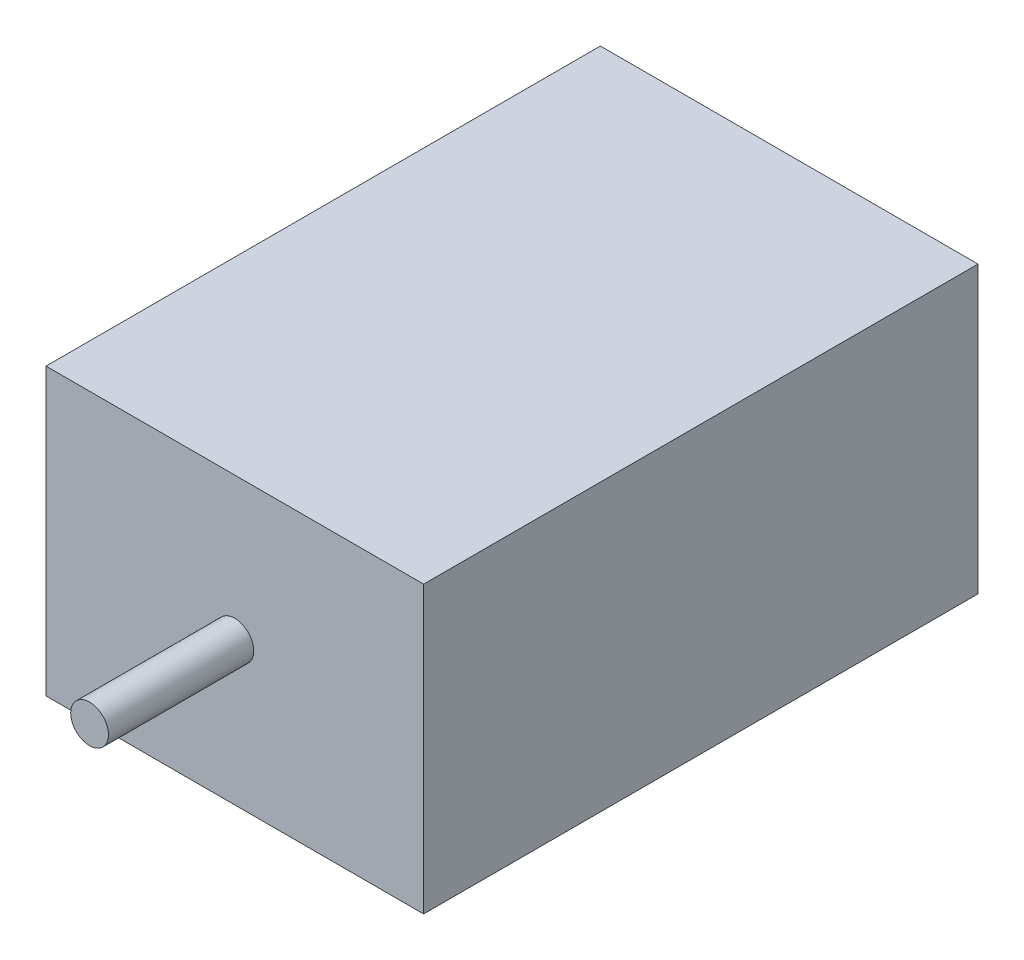
ISO-10303-21;
HEADER;
FILE_DESCRIPTION(('STEP AP214'),'2;1');
FILE_NAME('part.step','',(''),(''),'','','');
FILE_SCHEMA(('AUTOMOTIVE_DESIGN { 1 0 10303 214 1 1 1 1 }'));
ENDSEC;
DATA;
#1=APPLICATION_CONTEXT('core data for automotive mechanical design processes');
#2=APPLICATION_PROTOCOL_DEFINITION('international standard','automotive_design',2000,#1);
#3=PRODUCT_CONTEXT('',#1,'mechanical');
#4=PRODUCT('Part','Part','',(#3));
#5=PRODUCT_RELATED_PRODUCT_CATEGORY('part','',(#4));
#6=PRODUCT_DEFINITION_FORMATION('','',#4);
#7=PRODUCT_DEFINITION_CONTEXT('part definition',#1,'design');
#8=PRODUCT_DEFINITION('design','',#6,#7);
#9=PRODUCT_DEFINITION_SHAPE('','',#8);
#10=(LENGTH_UNIT() NAMED_UNIT(*) SI_UNIT(.MILLI.,.METRE.));
#11=(NAMED_UNIT(*) PLANE_ANGLE_UNIT() SI_UNIT($,.RADIAN.));
#12=(NAMED_UNIT(*) SI_UNIT($,.STERADIAN.) SOLID_ANGLE_UNIT());
#13=UNCERTAINTY_MEASURE_WITH_UNIT(LENGTH_MEASURE(1.E-05),#10,'distance_accuracy_value','');
#14=(GEOMETRIC_REPRESENTATION_CONTEXT(3) GLOBAL_UNCERTAINTY_ASSIGNED_CONTEXT((#13)) GLOBAL_UNIT_ASSIGNED_CONTEXT((#10,
#11,#12)) REPRESENTATION_CONTEXT('',''));
#15=CARTESIAN_POINT('',(0.,0.,0.));
#16=DIRECTION('',(0.,0.,1.));
#17=DIRECTION('',(1.,0.,0.));
#18=AXIS2_PLACEMENT_3D('',#15,#16,#17);
#19=CARTESIAN_POINT('',(0.,0.,29.083));
#20=DIRECTION('',(0.,0.,-1.));
#21=DIRECTION('',(-1.,0.,0.));
#22=AXIS2_PLACEMENT_3D('',#19,#20,#21);
#23=PLANE('',#22);
#24=DIRECTION('',(0.,-1.,0.));
#25=VECTOR('',#24,1.);
#26=CARTESIAN_POINT('',(0.,0.,29.083));
#27=LINE('',#26,#25);
#28=CARTESIAN_POINT('',(0.,14.986,29.083));
#29=VERTEX_POINT('',#28);
#30=CARTESIAN_POINT('',(0.,0.,29.083));
#31=VERTEX_POINT('',#30);
#32=EDGE_CURVE('E86',#29,#31,#27,.T.);
#33=ORIENTED_EDGE('',*,*,#32,.T.);
#34=DIRECTION('',(1.,0.,0.));
#35=VECTOR('',#34,1.);
#36=CARTESIAN_POINT('',(0.,0.,29.083));
#37=LINE('',#36,#35);
#38=CARTESIAN_POINT('',(19.812,0.,29.083));
#39=VERTEX_POINT('',#38);
#40=EDGE_CURVE('E81',#31,#39,#37,.T.);
#41=ORIENTED_EDGE('',*,*,#40,.T.);
#42=DIRECTION('',(0.,1.,0.));
#43=VECTOR('',#42,1.);
#44=CARTESIAN_POINT('',(19.812,0.,29.083));
#45=LINE('',#44,#43);
#46=CARTESIAN_POINT('',(19.812,14.986,29.083));
#47=VERTEX_POINT('',#46);
#48=EDGE_CURVE('E84',#39,#47,#45,.T.);
#49=ORIENTED_EDGE('',*,*,#48,.T.);
#50=DIRECTION('',(-1.,0.,0.));
#51=VECTOR('',#50,1.);
#52=CARTESIAN_POINT('',(0.,14.986,29.083));
#53=LINE('',#52,#51);
#54=EDGE_CURVE('E50',#47,#29,#53,.T.);
#55=ORIENTED_EDGE('',*,*,#54,.T.);
#56=EDGE_LOOP('',(#33,#41,#49,#55));
#57=FACE_BOUND('',#56,.T.);
#58=CARTESIAN_POINT('',(9.906,7.493,29.083));
#59=DIRECTION('',(0.,0.,-1.));
#60=DIRECTION('',(-1.,0.,0.));
#61=AXIS2_PLACEMENT_3D('',#58,#59,#60);
#62=CIRCLE('',#61,0.990599999999999);
#63=CARTESIAN_POINT('',(8.9154,7.493,29.083));
#64=VERTEX_POINT('',#63);
#65=EDGE_CURVE('E11',#64,#64,#62,.F.);
#66=ORIENTED_EDGE('',*,*,#65,.F.);
#67=EDGE_LOOP('',(#66));
#68=FACE_BOUND('',#67,.T.);
#69=ADVANCED_FACE('F33',(#57,#68),#23,.F.);
#70=CARTESIAN_POINT('',(0.,0.,29.083));
#71=DIRECTION('',(1.,0.,0.));
#72=DIRECTION('',(0.,0.,-1.));
#73=AXIS2_PLACEMENT_3D('',#70,#71,#72);
#74=PLANE('',#73);
#75=DIRECTION('',(0.,-1.,0.));
#76=VECTOR('',#75,1.);
#77=CARTESIAN_POINT('',(0.,0.,0.));
#78=LINE('',#77,#76);
#79=CARTESIAN_POINT('',(0.,14.986,0.));
#80=VERTEX_POINT('',#79);
#81=CARTESIAN_POINT('',(0.,0.,0.));
#82=VERTEX_POINT('',#81);
#83=EDGE_CURVE('E100',#80,#82,#78,.T.);
#84=ORIENTED_EDGE('',*,*,#83,.T.);
#85=DIRECTION('',(0.,0.,-1.));
#86=VECTOR('',#85,1.);
#87=CARTESIAN_POINT('',(0.,0.,29.083));
#88=LINE('',#87,#86);
#89=EDGE_CURVE('E42',#31,#82,#88,.T.);
#90=ORIENTED_EDGE('',*,*,#89,.F.);
#91=ORIENTED_EDGE('',*,*,#32,.F.);
#92=DIRECTION('',(0.,0.,-1.));
#93=VECTOR('',#92,1.);
#94=CARTESIAN_POINT('',(0.,14.986,29.083));
#95=LINE('',#94,#93);
#96=EDGE_CURVE('E96',#29,#80,#95,.T.);
#97=ORIENTED_EDGE('',*,*,#96,.T.);
#98=EDGE_LOOP('',(#84,#90,#91,#97));
#99=FACE_BOUND('',#98,.T.);
#100=ADVANCED_FACE('F35',(#99),#74,.F.);
#101=CARTESIAN_POINT('',(0.,0.,29.083));
#102=DIRECTION('',(0.,1.,0.));
#103=DIRECTION('',(0.,0.,1.));
#104=AXIS2_PLACEMENT_3D('',#101,#102,#103);
#105=PLANE('',#104);
#106=DIRECTION('',(1.,0.,0.));
#107=VECTOR('',#106,1.);
#108=CARTESIAN_POINT('',(0.,0.,0.));
#109=LINE('',#108,#107);
#110=CARTESIAN_POINT('',(19.812,0.,0.));
#111=VERTEX_POINT('',#110);
#112=EDGE_CURVE('E91',#82,#111,#109,.T.);
#113=ORIENTED_EDGE('',*,*,#112,.T.);
#114=DIRECTION('',(0.,0.,-1.));
#115=VECTOR('',#114,1.);
#116=CARTESIAN_POINT('',(19.812,0.,29.083));
#117=LINE('',#116,#115);
#118=EDGE_CURVE('E89',#39,#111,#117,.T.);
#119=ORIENTED_EDGE('',*,*,#118,.F.);
#120=ORIENTED_EDGE('',*,*,#40,.F.);
#121=ORIENTED_EDGE('',*,*,#89,.T.);
#122=EDGE_LOOP('',(#113,#119,#120,#121));
#123=FACE_BOUND('',#122,.T.);
#124=ADVANCED_FACE('F90',(#123),#105,.F.);
#125=CARTESIAN_POINT('',(19.812,0.,29.083));
#126=DIRECTION('',(-1.,0.,0.));
#127=DIRECTION('',(0.,-1.,0.));
#128=AXIS2_PLACEMENT_3D('',#125,#126,#127);
#129=PLANE('',#128);
#130=DIRECTION('',(0.,1.,0.));
#131=VECTOR('',#130,1.);
#132=CARTESIAN_POINT('',(19.812,0.,0.));
#133=LINE('',#132,#131);
#134=CARTESIAN_POINT('',(19.812,14.986,0.));
#135=VERTEX_POINT('',#134);
#136=EDGE_CURVE('E67',#111,#135,#133,.T.);
#137=ORIENTED_EDGE('',*,*,#136,.T.);
#138=DIRECTION('',(0.,0.,-1.));
#139=VECTOR('',#138,1.);
#140=CARTESIAN_POINT('',(19.812,14.986,29.083));
#141=LINE('',#140,#139);
#142=EDGE_CURVE('E92',#47,#135,#141,.T.);
#143=ORIENTED_EDGE('',*,*,#142,.F.);
#144=ORIENTED_EDGE('',*,*,#48,.F.);
#145=ORIENTED_EDGE('',*,*,#118,.T.);
#146=EDGE_LOOP('',(#137,#143,#144,#145));
#147=FACE_BOUND('',#146,.T.);
#148=ADVANCED_FACE('F94',(#147),#129,.F.);
#149=CARTESIAN_POINT('',(0.,14.986,29.083));
#150=DIRECTION('',(0.,-1.,0.));
#151=DIRECTION('',(0.,0.,-1.));
#152=AXIS2_PLACEMENT_3D('',#149,#150,#151);
#153=PLANE('',#152);
#154=DIRECTION('',(-1.,0.,0.));
#155=VECTOR('',#154,1.);
#156=CARTESIAN_POINT('',(0.,14.986,0.));
#157=LINE('',#156,#155);
#158=EDGE_CURVE('E73',#135,#80,#157,.T.);
#159=ORIENTED_EDGE('',*,*,#158,.T.);
#160=ORIENTED_EDGE('',*,*,#96,.F.);
#161=ORIENTED_EDGE('',*,*,#54,.F.);
#162=ORIENTED_EDGE('',*,*,#142,.T.);
#163=EDGE_LOOP('',(#159,#160,#161,#162));
#164=FACE_BOUND('',#163,.T.);
#165=ADVANCED_FACE('F114',(#164),#153,.F.);
#166=CARTESIAN_POINT('',(0.,0.,0.));
#167=DIRECTION('',(0.,0.,-1.));
#168=DIRECTION('',(-1.,0.,0.));
#169=AXIS2_PLACEMENT_3D('',#166,#167,#168);
#170=PLANE('',#169);
#171=ORIENTED_EDGE('',*,*,#83,.F.);
#172=ORIENTED_EDGE('',*,*,#158,.F.);
#173=ORIENTED_EDGE('',*,*,#136,.F.);
#174=ORIENTED_EDGE('',*,*,#112,.F.);
#175=EDGE_LOOP('',(#171,#172,#173,#174));
#176=FACE_BOUND('',#175,.T.);
#177=ADVANCED_FACE('F111',(#176),#170,.T.);
#178=CARTESIAN_POINT('',(9.906,7.493,36.703));
#179=DIRECTION('',(0.,0.,-1.));
#180=DIRECTION('',(-1.,0.,0.));
#181=AXIS2_PLACEMENT_3D('',#178,#179,#180);
#182=CYLINDRICAL_SURFACE('',#181,0.990599999999999);
#183=CARTESIAN_POINT('',(9.906,7.493,36.703));
#184=DIRECTION('',(0.,0.,1.));
#185=DIRECTION('',(1.,0.,0.));
#186=AXIS2_PLACEMENT_3D('',#183,#184,#185);
#187=CIRCLE('',#186,0.990599999999999);
#188=CARTESIAN_POINT('',(8.9154,7.493,36.703));
#189=VERTEX_POINT('',#188);
#190=EDGE_CURVE('E103',#189,#189,#187,.T.);
#191=CARTESIAN_POINT('',(8.9154,7.493,36.703));
#192=CARTESIAN_POINT('',(8.9154,7.493,36.623625));
#193=CARTESIAN_POINT('',(8.9154,7.493,36.54425));
#194=CARTESIAN_POINT('',(8.9154,7.493,36.3855));
#195=CARTESIAN_POINT('',(8.9154,7.493,36.306125));
#196=CARTESIAN_POINT('',(8.9154,7.493,36.147375));
#197=CARTESIAN_POINT('',(8.9154,7.493,36.068));
#198=CARTESIAN_POINT('',(8.9154,7.493,35.90925));
#199=CARTESIAN_POINT('',(8.9154,7.493,35.829875));
#200=CARTESIAN_POINT('',(8.9154,7.493,35.671125));
#201=CARTESIAN_POINT('',(8.9154,7.493,35.59175));
#202=CARTESIAN_POINT('',(8.9154,7.493,35.433));
#203=CARTESIAN_POINT('',(8.9154,7.493,35.353625));
#204=CARTESIAN_POINT('',(8.9154,7.493,35.194875));
#205=CARTESIAN_POINT('',(8.9154,7.493,35.1155));
#206=CARTESIAN_POINT('',(8.9154,7.493,34.95675));
#207=CARTESIAN_POINT('',(8.9154,7.493,34.877375));
#208=CARTESIAN_POINT('',(8.9154,7.493,34.718625));
#209=CARTESIAN_POINT('',(8.9154,7.493,34.63925));
#210=CARTESIAN_POINT('',(8.9154,7.493,34.4805));
#211=CARTESIAN_POINT('',(8.9154,7.493,34.401125));
#212=CARTESIAN_POINT('',(8.9154,7.493,34.242375));
#213=CARTESIAN_POINT('',(8.9154,7.493,34.163));
#214=CARTESIAN_POINT('',(8.9154,7.493,34.00425));
#215=CARTESIAN_POINT('',(8.9154,7.493,33.924875));
#216=CARTESIAN_POINT('',(8.9154,7.493,33.766125));
#217=CARTESIAN_POINT('',(8.9154,7.493,33.68675));
#218=CARTESIAN_POINT('',(8.9154,7.493,33.528));
#219=CARTESIAN_POINT('',(8.9154,7.493,33.448625));
#220=CARTESIAN_POINT('',(8.9154,7.493,33.289875));
#221=CARTESIAN_POINT('',(8.9154,7.493,33.2105));
#222=CARTESIAN_POINT('',(8.9154,7.493,33.05175));
#223=CARTESIAN_POINT('',(8.9154,7.493,32.972375));
#224=CARTESIAN_POINT('',(8.9154,7.493,32.813625));
#225=CARTESIAN_POINT('',(8.9154,7.493,32.73425));
#226=CARTESIAN_POINT('',(8.9154,7.493,32.5755));
#227=CARTESIAN_POINT('',(8.9154,7.493,32.496125));
#228=CARTESIAN_POINT('',(8.9154,7.493,32.337375));
#229=CARTESIAN_POINT('',(8.9154,7.493,32.258));
#230=CARTESIAN_POINT('',(8.9154,7.493,32.09925));
#231=CARTESIAN_POINT('',(8.9154,7.493,32.019875));
#232=CARTESIAN_POINT('',(8.9154,7.493,31.861125));
#233=CARTESIAN_POINT('',(8.9154,7.493,31.78175));
#234=CARTESIAN_POINT('',(8.9154,7.493,31.623));
#235=CARTESIAN_POINT('',(8.9154,7.493,31.543625));
#236=CARTESIAN_POINT('',(8.9154,7.493,31.384875));
#237=CARTESIAN_POINT('',(8.9154,7.493,31.3055));
#238=CARTESIAN_POINT('',(8.9154,7.493,31.14675));
#239=CARTESIAN_POINT('',(8.9154,7.493,31.067375));
#240=CARTESIAN_POINT('',(8.9154,7.493,30.908625));
#241=CARTESIAN_POINT('',(8.9154,7.493,30.82925));
#242=CARTESIAN_POINT('',(8.9154,7.493,30.6705));
#243=CARTESIAN_POINT('',(8.9154,7.493,30.591125));
#244=CARTESIAN_POINT('',(8.9154,7.493,30.432375));
#245=CARTESIAN_POINT('',(8.9154,7.493,30.353));
#246=CARTESIAN_POINT('',(8.9154,7.493,30.19425));
#247=CARTESIAN_POINT('',(8.9154,7.493,30.114875));
#248=CARTESIAN_POINT('',(8.9154,7.493,29.956125));
#249=CARTESIAN_POINT('',(8.9154,7.493,29.87675));
#250=CARTESIAN_POINT('',(8.9154,7.493,29.718));
#251=CARTESIAN_POINT('',(8.9154,7.493,29.638625));
#252=CARTESIAN_POINT('',(8.9154,7.493,29.479875));
#253=CARTESIAN_POINT('',(8.9154,7.493,29.4005));
#254=CARTESIAN_POINT('',(8.9154,7.493,29.24175));
#255=CARTESIAN_POINT('',(8.9154,7.493,29.162375));
#256=CARTESIAN_POINT('',(8.9154,7.493,29.083));
#257=B_SPLINE_CURVE_WITH_KNOTS('',3,(#191,#192,#193,#194,#195,#196,#197,#198,#199,#200,#201,
#202,#203,#204,#205,#206,#207,#208,#209,#210,#211,#212,#213,#214,#215,#216,#217,#218,#219,#220,
#221,#222,#223,#224,#225,#226,#227,#228,#229,#230,#231,#232,#233,#234,#235,#236,#237,#238,#239,
#240,#241,#242,#243,#244,#245,#246,#247,#248,#249,#250,#251,#252,#253,#254,#255,#256),
.UNSPECIFIED.,.F.,.F.,(4,2,2,2,2,2,2,2,2,2,2,2,2,2,2,2,2,2,2,2,2,2,2,2,2,2,2,2,2,2,2,2,4),(0.,
0.238124999999999,0.476249999999998,0.714374999999996,0.952499999999995,1.19062499999999,
1.42874999999999,1.666875,1.905,2.143125,2.38124999999999,2.61937499999999,2.85749999999999,
3.09562499999999,3.33375,3.571875,3.80999999999999,4.04812499999999,4.28624999999999,
4.52437499999999,4.7625,5.00062499999999,5.23874999999999,5.47687499999999,5.71499999999999,
5.95312499999999,6.19124999999999,6.42937499999999,6.66749999999999,6.90562499999999,
7.14374999999999,7.38187499999999,7.61999999999999),.UNSPECIFIED.);
#258=EDGE_CURVE('BSEAM113',#189,#64,#257,.T.);
#259=ORIENTED_EDGE('',*,*,#190,.F.);
#260=ORIENTED_EDGE('',*,*,#65,.T.);
#261=ORIENTED_EDGE('',*,*,#258,.T.);
#262=ORIENTED_EDGE('',*,*,#258,.F.);
#263=EDGE_LOOP('',(#259,#261,#260,#262));
#264=FACE_BOUND('',#263,.T.);
#265=ADVANCED_FACE('F113',(#264),#182,.T.);
#266=CARTESIAN_POINT('',(9.906,7.493,36.703));
#267=DIRECTION('',(0.,0.,1.));
#268=DIRECTION('',(1.,0.,0.));
#269=AXIS2_PLACEMENT_3D('',#266,#267,#268);
#270=PLANE('',#269);
#271=ORIENTED_EDGE('',*,*,#190,.T.);
#272=EDGE_LOOP('',(#271));
#273=FACE_BOUND('',#272,.T.);
#274=ADVANCED_FACE('F120',(#273),#270,.T.);
#275=CLOSED_SHELL('',(#69,#100,#124,#148,#165,#177,#265,#274));
#276=MANIFOLD_SOLID_BREP('B2',#275);
#277=ADVANCED_BREP_SHAPE_REPRESENTATION('',(#18,#276),#14);
#278=SHAPE_DEFINITION_REPRESENTATION(#9,#277);
ENDSEC;
END-ISO-10303-21;
